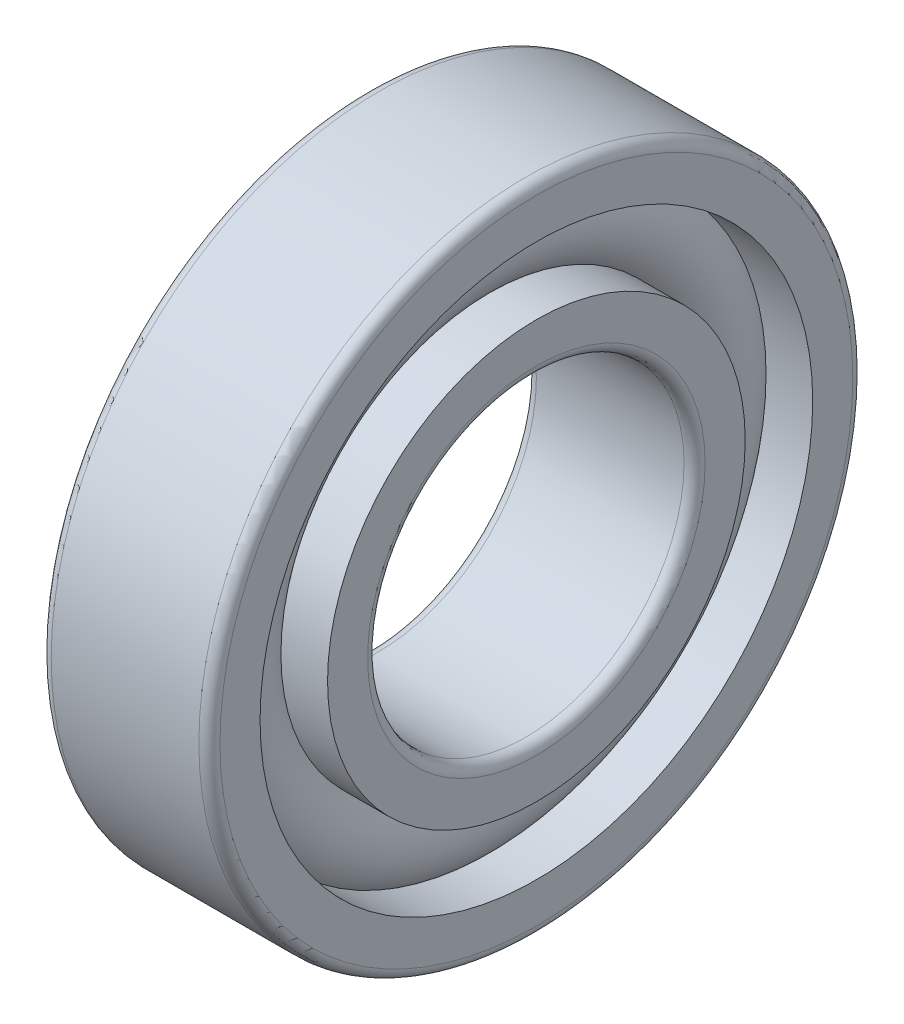
ISO-10303-21;
HEADER;
FILE_DESCRIPTION(('STEP AP214'),'2;1');
FILE_NAME('part.step','',(''),(''),'','','');
FILE_SCHEMA(('AUTOMOTIVE_DESIGN { 1 0 10303 214 1 1 1 1 }'));
ENDSEC;
DATA;
#1=APPLICATION_CONTEXT('core data for automotive mechanical design processes');
#2=APPLICATION_PROTOCOL_DEFINITION('international standard','automotive_design',2000,#1);
#3=PRODUCT_CONTEXT('',#1,'mechanical');
#4=PRODUCT('Part','Part','',(#3));
#5=PRODUCT_RELATED_PRODUCT_CATEGORY('part','',(#4));
#6=PRODUCT_DEFINITION_FORMATION('','',#4);
#7=PRODUCT_DEFINITION_CONTEXT('part definition',#1,'design');
#8=PRODUCT_DEFINITION('design','',#6,#7);
#9=PRODUCT_DEFINITION_SHAPE('','',#8);
#10=(LENGTH_UNIT() NAMED_UNIT(*) SI_UNIT(.MILLI.,.METRE.));
#11=(NAMED_UNIT(*) PLANE_ANGLE_UNIT() SI_UNIT($,.RADIAN.));
#12=(NAMED_UNIT(*) SI_UNIT($,.STERADIAN.) SOLID_ANGLE_UNIT());
#13=UNCERTAINTY_MEASURE_WITH_UNIT(LENGTH_MEASURE(1.E-05),#10,'distance_accuracy_value','');
#14=(GEOMETRIC_REPRESENTATION_CONTEXT(3) GLOBAL_UNCERTAINTY_ASSIGNED_CONTEXT((#13)) GLOBAL_UNIT_ASSIGNED_CONTEXT((#10,
#11,#12)) REPRESENTATION_CONTEXT('',''));
#15=CARTESIAN_POINT('',(0.,0.,0.));
#16=DIRECTION('',(0.,0.,1.));
#17=DIRECTION('',(1.,0.,0.));
#18=AXIS2_PLACEMENT_3D('',#15,#16,#17);
#19=CARTESIAN_POINT('',(-1.49242781242265,0.170524746749834,0.671681815674674));
#20=DIRECTION('',(-1.,0.,0.));
#21=DIRECTION('',(0.,0.,1.));
#22=AXIS2_PLACEMENT_3D('',#19,#20,#21);
#23=TOROIDAL_SURFACE('',#22,23.,4.8);
#24=CARTESIAN_POINT('',(2.08528095157701,0.170524746749834,0.671681815674674));
#25=DIRECTION('',(-1.,0.,0.));
#26=DIRECTION('',(0.,0.,1.));
#27=AXIS2_PLACEMENT_3D('',#24,#25,#26);
#28=CIRCLE('',#27,26.2);
#29=CARTESIAN_POINT('',(2.08528095157701,0.170524746749834,26.8716818156747));
#30=VERTEX_POINT('',#29);
#31=EDGE_CURVE('E18',#30,#30,#28,.F.);
#32=ORIENTED_EDGE('',*,*,#31,.T.);
#33=EDGE_LOOP('',(#32));
#34=FACE_BOUND('',#33,.T.);
#35=CARTESIAN_POINT('',(2.08528095157701,0.170524746749834,0.671681815674674));
#36=DIRECTION('',(-1.,0.,0.));
#37=DIRECTION('',(0.,0.,1.));
#38=AXIS2_PLACEMENT_3D('',#35,#36,#37);
#39=CIRCLE('',#38,19.8);
#40=CARTESIAN_POINT('',(2.08528095157701,0.170524746749834,20.4716818156747));
#41=VERTEX_POINT('',#40);
#42=EDGE_CURVE('E9',#41,#41,#39,.T.);
#43=ORIENTED_EDGE('',*,*,#42,.T.);
#44=EDGE_LOOP('',(#43));
#45=FACE_BOUND('',#44,.T.);
#46=ADVANCED_FACE('F14',(#34,#45),#23,.T.);
#47=CARTESIAN_POINT('',(-22.1299278124226,0.170524746749834,0.671681815674674));
#48=DIRECTION('',(1.,0.,0.));
#49=DIRECTION('',(0.,0.,-1.));
#50=AXIS2_PLACEMENT_3D('',#47,#48,#49);
#51=CYLINDRICAL_SURFACE('',#50,19.8);
#52=CARTESIAN_POINT('',(6.50757218757735,0.170524746749834,0.671681815674674));
#53=DIRECTION('',(1.,0.,0.));
#54=DIRECTION('',(0.,0.,-1.));
#55=AXIS2_PLACEMENT_3D('',#52,#53,#54);
#56=CIRCLE('',#55,19.8);
#57=CARTESIAN_POINT('',(6.50757218757735,0.170524746749834,-19.1283181843253));
#58=VERTEX_POINT('',#57);
#59=EDGE_CURVE('E27',#58,#58,#56,.T.);
#60=ORIENTED_EDGE('',*,*,#59,.F.);
#61=EDGE_LOOP('',(#60));
#62=FACE_BOUND('',#61,.T.);
#63=ORIENTED_EDGE('',*,*,#42,.F.);
#64=EDGE_LOOP('',(#63));
#65=FACE_BOUND('',#64,.T.);
#66=ADVANCED_FACE('F66',(#62,#65),#51,.T.);
#67=CARTESIAN_POINT('',(-22.1299278124226,0.170524746749834,0.671681815674674));
#68=DIRECTION('',(1.,0.,0.));
#69=DIRECTION('',(0.,0.,-1.));
#70=AXIS2_PLACEMENT_3D('',#67,#68,#69);
#71=CYLINDRICAL_SURFACE('',#70,19.8);
#72=CARTESIAN_POINT('',(-9.49242781242265,0.170524746749834,0.671681815674674));
#73=DIRECTION('',(1.,0.,0.));
#74=DIRECTION('',(0.,0.,-1.));
#75=AXIS2_PLACEMENT_3D('',#72,#73,#74);
#76=CIRCLE('',#75,19.8);
#77=CARTESIAN_POINT('',(-9.49242781242265,0.170524746749834,-19.1283181843253));
#78=VERTEX_POINT('',#77);
#79=EDGE_CURVE('E36',#78,#78,#76,.T.);
#80=ORIENTED_EDGE('',*,*,#79,.T.);
#81=EDGE_LOOP('',(#80));
#82=FACE_BOUND('',#81,.T.);
#83=CARTESIAN_POINT('',(-5.07013657642231,0.170524746749834,0.671681815674674));
#84=DIRECTION('',(1.,0.,0.));
#85=DIRECTION('',(0.,0.,-1.));
#86=AXIS2_PLACEMENT_3D('',#83,#84,#85);
#87=CIRCLE('',#86,19.8);
#88=CARTESIAN_POINT('',(-5.07013657642231,0.170524746749834,-19.1283181843253));
#89=VERTEX_POINT('',#88);
#90=EDGE_CURVE('E22',#89,#89,#87,.T.);
#91=ORIENTED_EDGE('',*,*,#90,.F.);
#92=EDGE_LOOP('',(#91));
#93=FACE_BOUND('',#92,.T.);
#94=ADVANCED_FACE('F69',(#82,#93),#71,.T.);
#95=CARTESIAN_POINT('',(6.50757218757735,16.1705247467498,0.671681815674674));
#96=DIRECTION('',(1.,0.,0.));
#97=DIRECTION('',(0.,0.,-1.));
#98=AXIS2_PLACEMENT_3D('',#95,#96,#97);
#99=PLANE('',#98);
#100=ORIENTED_EDGE('',*,*,#59,.T.);
#101=EDGE_LOOP('',(#100));
#102=FACE_BOUND('',#101,.T.);
#103=CARTESIAN_POINT('',(6.50757218757735,0.170524746749834,0.671681815674674));
#104=DIRECTION('',(1.,0.,0.));
#105=DIRECTION('',(0.,0.,-1.));
#106=AXIS2_PLACEMENT_3D('',#103,#104,#105);
#107=CIRCLE('',#106,16.);
#108=CARTESIAN_POINT('',(6.50757218757735,0.170524746749834,-15.3283181843253));
#109=VERTEX_POINT('',#108);
#110=EDGE_CURVE('E58',#109,#109,#107,.T.);
#111=ORIENTED_EDGE('',*,*,#110,.F.);
#112=EDGE_LOOP('',(#111));
#113=FACE_BOUND('',#112,.T.);
#114=ADVANCED_FACE('F63',(#102,#113),#99,.T.);
#115=CARTESIAN_POINT('',(5.50757218757735,0.170524746749834,0.671681815674674));
#116=DIRECTION('',(1.,0.,0.));
#117=DIRECTION('',(0.,0.,-1.));
#118=AXIS2_PLACEMENT_3D('',#115,#116,#117);
#119=TOROIDAL_SURFACE('',#118,16.,1.);
#120=ORIENTED_EDGE('',*,*,#110,.T.);
#121=EDGE_LOOP('',(#120));
#122=FACE_BOUND('',#121,.T.);
#123=CARTESIAN_POINT('',(5.50757218757735,0.170524746749834,0.671681815674674));
#124=DIRECTION('',(1.,0.,0.));
#125=DIRECTION('',(0.,0.,-1.));
#126=AXIS2_PLACEMENT_3D('',#123,#124,#125);
#127=CIRCLE('',#126,15.);
#128=CARTESIAN_POINT('',(5.50757218757735,0.170524746749834,-14.3283181843253));
#129=VERTEX_POINT('',#128);
#130=EDGE_CURVE('E55',#129,#129,#127,.T.);
#131=ORIENTED_EDGE('',*,*,#130,.F.);
#132=EDGE_LOOP('',(#131));
#133=FACE_BOUND('',#132,.T.);
#134=ADVANCED_FACE('F81',(#122,#133),#119,.T.);
#135=CARTESIAN_POINT('',(-22.1299278124226,0.170524746749834,0.671681815674674));
#136=DIRECTION('',(1.,0.,0.));
#137=DIRECTION('',(0.,0.,-1.));
#138=AXIS2_PLACEMENT_3D('',#135,#136,#137);
#139=CYLINDRICAL_SURFACE('',#138,15.);
#140=ORIENTED_EDGE('',*,*,#130,.T.);
#141=EDGE_LOOP('',(#140));
#142=FACE_BOUND('',#141,.T.);
#143=CARTESIAN_POINT('',(-8.49242781242265,0.170524746749834,0.671681815674674));
#144=DIRECTION('',(1.,0.,0.));
#145=DIRECTION('',(0.,0.,-1.));
#146=AXIS2_PLACEMENT_3D('',#143,#144,#145);
#147=CIRCLE('',#146,15.);
#148=CARTESIAN_POINT('',(-8.49242781242265,0.170524746749834,-14.3283181843253));
#149=VERTEX_POINT('',#148);
#150=EDGE_CURVE('E52',#149,#149,#147,.T.);
#151=ORIENTED_EDGE('',*,*,#150,.F.);
#152=EDGE_LOOP('',(#151));
#153=FACE_BOUND('',#152,.T.);
#154=ADVANCED_FACE('F84',(#142,#153),#139,.F.);
#155=CARTESIAN_POINT('',(-8.49242781242265,0.170524746749834,0.671681815674674));
#156=DIRECTION('',(1.,0.,0.));
#157=DIRECTION('',(0.,0.,-1.));
#158=AXIS2_PLACEMENT_3D('',#155,#156,#157);
#159=TOROIDAL_SURFACE('',#158,16.,1.);
#160=ORIENTED_EDGE('',*,*,#150,.T.);
#161=EDGE_LOOP('',(#160));
#162=FACE_BOUND('',#161,.T.);
#163=CARTESIAN_POINT('',(-9.49242781242265,0.170524746749834,0.671681815674674));
#164=DIRECTION('',(1.,0.,0.));
#165=DIRECTION('',(0.,0.,-1.));
#166=AXIS2_PLACEMENT_3D('',#163,#164,#165);
#167=CIRCLE('',#166,16.);
#168=CARTESIAN_POINT('',(-9.49242781242265,0.170524746749834,-15.3283181843253));
#169=VERTEX_POINT('',#168);
#170=EDGE_CURVE('E49',#169,#169,#167,.T.);
#171=ORIENTED_EDGE('',*,*,#170,.F.);
#172=EDGE_LOOP('',(#171));
#173=FACE_BOUND('',#172,.T.);
#174=ADVANCED_FACE('F88',(#162,#173),#159,.T.);
#175=CARTESIAN_POINT('',(-9.49242781242265,19.9705247467498,0.671681815674674));
#176=DIRECTION('',(-1.,0.,0.));
#177=DIRECTION('',(0.,0.,1.));
#178=AXIS2_PLACEMENT_3D('',#175,#176,#177);
#179=PLANE('',#178);
#180=ORIENTED_EDGE('',*,*,#170,.T.);
#181=EDGE_LOOP('',(#180));
#182=FACE_BOUND('',#181,.T.);
#183=ORIENTED_EDGE('',*,*,#79,.F.);
#184=EDGE_LOOP('',(#183));
#185=FACE_BOUND('',#184,.T.);
#186=ADVANCED_FACE('F92',(#182,#185),#179,.T.);
#187=CARTESIAN_POINT('',(-5.07013657642231,0.170524746749834,0.671681815674674));
#188=DIRECTION('',(1.,0.,0.));
#189=DIRECTION('',(0.,0.,-1.));
#190=AXIS2_PLACEMENT_3D('',#187,#188,#189);
#191=CIRCLE('',#190,26.2);
#192=CARTESIAN_POINT('',(-5.07013657642231,0.170524746749834,-25.5283181843253));
#193=VERTEX_POINT('',#192);
#194=EDGE_CURVE('E30',#193,#193,#191,.F.);
#195=ORIENTED_EDGE('',*,*,#194,.T.);
#196=EDGE_LOOP('',(#195));
#197=FACE_BOUND('',#196,.T.);
#198=ORIENTED_EDGE('',*,*,#90,.T.);
#199=EDGE_LOOP('',(#198));
#200=FACE_BOUND('',#199,.T.);
#201=ADVANCED_FACE('F16',(#197,#200),#23,.T.);
#202=CARTESIAN_POINT('',(-22.1299278124226,0.170524746749834,0.671681815674674));
#203=DIRECTION('',(1.,0.,0.));
#204=DIRECTION('',(0.,0.,-1.));
#205=AXIS2_PLACEMENT_3D('',#202,#203,#204);
#206=CYLINDRICAL_SURFACE('',#205,26.2);
#207=CARTESIAN_POINT('',(6.50757218757735,0.170524746749834,0.671681815674674));
#208=DIRECTION('',(1.,0.,0.));
#209=DIRECTION('',(0.,0.,-1.));
#210=AXIS2_PLACEMENT_3D('',#207,#208,#209);
#211=CIRCLE('',#210,26.2);
#212=CARTESIAN_POINT('',(6.50757218757735,0.170524746749834,-25.5283181843253));
#213=VERTEX_POINT('',#212);
#214=EDGE_CURVE('E32',#213,#213,#211,.T.);
#215=ORIENTED_EDGE('',*,*,#214,.T.);
#216=EDGE_LOOP('',(#215));
#217=FACE_BOUND('',#216,.T.);
#218=ORIENTED_EDGE('',*,*,#31,.F.);
#219=EDGE_LOOP('',(#218));
#220=FACE_BOUND('',#219,.T.);
#221=ADVANCED_FACE('F97',(#217,#220),#206,.F.);
#222=CARTESIAN_POINT('',(-22.1299278124226,0.170524746749834,0.671681815674674));
#223=DIRECTION('',(1.,0.,0.));
#224=DIRECTION('',(0.,0.,-1.));
#225=AXIS2_PLACEMENT_3D('',#222,#223,#224);
#226=CYLINDRICAL_SURFACE('',#225,26.2);
#227=CARTESIAN_POINT('',(-9.49242781242264,0.170524746749834,0.671681815674674));
#228=DIRECTION('',(1.,0.,0.));
#229=DIRECTION('',(0.,0.,-1.));
#230=AXIS2_PLACEMENT_3D('',#227,#228,#229);
#231=CIRCLE('',#230,26.2);
#232=CARTESIAN_POINT('',(-9.49242781242264,0.170524746749834,-25.5283181843253));
#233=VERTEX_POINT('',#232);
#234=EDGE_CURVE('E128',#233,#233,#231,.T.);
#235=ORIENTED_EDGE('',*,*,#234,.F.);
#236=EDGE_LOOP('',(#235));
#237=FACE_BOUND('',#236,.T.);
#238=ORIENTED_EDGE('',*,*,#194,.F.);
#239=EDGE_LOOP('',(#238));
#240=FACE_BOUND('',#239,.T.);
#241=ADVANCED_FACE('F100',(#237,#240),#226,.F.);
#242=CARTESIAN_POINT('',(6.50757218757735,30.1705247467498,0.671681815674674));
#243=DIRECTION('',(1.,0.,0.));
#244=DIRECTION('',(0.,0.,-1.));
#245=AXIS2_PLACEMENT_3D('',#242,#243,#244);
#246=PLANE('',#245);
#247=CARTESIAN_POINT('',(6.50757218757735,0.170524746749834,0.671681815674674));
#248=DIRECTION('',(1.,0.,0.));
#249=DIRECTION('',(0.,0.,-1.));
#250=AXIS2_PLACEMENT_3D('',#247,#248,#249);
#251=CIRCLE('',#250,30.);
#252=CARTESIAN_POINT('',(6.50757218757735,0.170524746749834,-29.3283181843253));
#253=VERTEX_POINT('',#252);
#254=EDGE_CURVE('E38',#253,#253,#251,.T.);
#255=ORIENTED_EDGE('',*,*,#254,.T.);
#256=EDGE_LOOP('',(#255));
#257=FACE_BOUND('',#256,.T.);
#258=ORIENTED_EDGE('',*,*,#214,.F.);
#259=EDGE_LOOP('',(#258));
#260=FACE_BOUND('',#259,.T.);
#261=ADVANCED_FACE('F101',(#257,#260),#246,.T.);
#262=CARTESIAN_POINT('',(5.50757218757735,0.170524746749834,0.671681815674674));
#263=DIRECTION('',(1.,0.,0.));
#264=DIRECTION('',(0.,0.,-1.));
#265=AXIS2_PLACEMENT_3D('',#262,#263,#264);
#266=TOROIDAL_SURFACE('',#265,30.,0.999999999999998);
#267=CARTESIAN_POINT('',(5.50757218757735,0.170524746749834,0.671681815674674));
#268=DIRECTION('',(1.,0.,0.));
#269=DIRECTION('',(0.,0.,-1.));
#270=AXIS2_PLACEMENT_3D('',#267,#268,#269);
#271=CIRCLE('',#270,31.);
#272=CARTESIAN_POINT('',(5.50757218757735,0.170524746749834,-30.3283181843253));
#273=VERTEX_POINT('',#272);
#274=EDGE_CURVE('E43',#273,#273,#271,.T.);
#275=ORIENTED_EDGE('',*,*,#274,.T.);
#276=EDGE_LOOP('',(#275));
#277=FACE_BOUND('',#276,.T.);
#278=ORIENTED_EDGE('',*,*,#254,.F.);
#279=EDGE_LOOP('',(#278));
#280=FACE_BOUND('',#279,.T.);
#281=ADVANCED_FACE('F104',(#277,#280),#266,.T.);
#282=CARTESIAN_POINT('',(-22.1299278124226,0.170524746749834,0.671681815674674));
#283=DIRECTION('',(1.,0.,0.));
#284=DIRECTION('',(0.,0.,-1.));
#285=AXIS2_PLACEMENT_3D('',#282,#283,#284);
#286=CYLINDRICAL_SURFACE('',#285,31.);
#287=CARTESIAN_POINT('',(-8.49242781242265,0.170524746749834,0.671681815674674));
#288=DIRECTION('',(1.,0.,0.));
#289=DIRECTION('',(0.,0.,-1.));
#290=AXIS2_PLACEMENT_3D('',#287,#288,#289);
#291=CIRCLE('',#290,31.);
#292=CARTESIAN_POINT('',(-8.49242781242265,0.170524746749834,-30.3283181843253));
#293=VERTEX_POINT('',#292);
#294=EDGE_CURVE('E132',#293,#293,#291,.T.);
#295=ORIENTED_EDGE('',*,*,#294,.T.);
#296=EDGE_LOOP('',(#295));
#297=FACE_BOUND('',#296,.T.);
#298=ORIENTED_EDGE('',*,*,#274,.F.);
#299=EDGE_LOOP('',(#298));
#300=FACE_BOUND('',#299,.T.);
#301=ADVANCED_FACE('F108',(#297,#300),#286,.T.);
#302=CARTESIAN_POINT('',(-8.49242781242265,0.170524746749834,0.671681815674674));
#303=DIRECTION('',(1.,0.,0.));
#304=DIRECTION('',(0.,0.,-1.));
#305=AXIS2_PLACEMENT_3D('',#302,#303,#304);
#306=TOROIDAL_SURFACE('',#305,30.,0.999999999999998);
#307=CARTESIAN_POINT('',(-9.49242781242264,0.170524746749834,0.671681815674674));
#308=DIRECTION('',(1.,0.,0.));
#309=DIRECTION('',(0.,0.,-1.));
#310=AXIS2_PLACEMENT_3D('',#307,#308,#309);
#311=CIRCLE('',#310,30.);
#312=CARTESIAN_POINT('',(-9.49242781242264,0.170524746749834,-29.3283181843253));
#313=VERTEX_POINT('',#312);
#314=EDGE_CURVE('E129',#313,#313,#311,.T.);
#315=ORIENTED_EDGE('',*,*,#314,.T.);
#316=EDGE_LOOP('',(#315));
#317=FACE_BOUND('',#316,.T.);
#318=ORIENTED_EDGE('',*,*,#294,.F.);
#319=EDGE_LOOP('',(#318));
#320=FACE_BOUND('',#319,.T.);
#321=ADVANCED_FACE('F112',(#317,#320),#306,.T.);
#322=CARTESIAN_POINT('',(-9.49242781242264,26.3705247467498,0.671681815674674));
#323=DIRECTION('',(-1.,0.,0.));
#324=DIRECTION('',(0.,0.,1.));
#325=AXIS2_PLACEMENT_3D('',#322,#323,#324);
#326=PLANE('',#325);
#327=ORIENTED_EDGE('',*,*,#234,.T.);
#328=EDGE_LOOP('',(#327));
#329=FACE_BOUND('',#328,.T.);
#330=ORIENTED_EDGE('',*,*,#314,.F.);
#331=EDGE_LOOP('',(#330));
#332=FACE_BOUND('',#331,.T.);
#333=ADVANCED_FACE('F116',(#329,#332),#326,.T.);
#334=CLOSED_SHELL('',(#46,#66,#94,#114,#134,#154,#174,#186,#201,#221,#241,#261,#281,#301,#321,#333));
#335=MANIFOLD_SOLID_BREP('B1',#334);
#336=ADVANCED_BREP_SHAPE_REPRESENTATION('',(#18,#335),#14);
#337=SHAPE_DEFINITION_REPRESENTATION(#9,#336);
ENDSEC;
END-ISO-10303-21;
